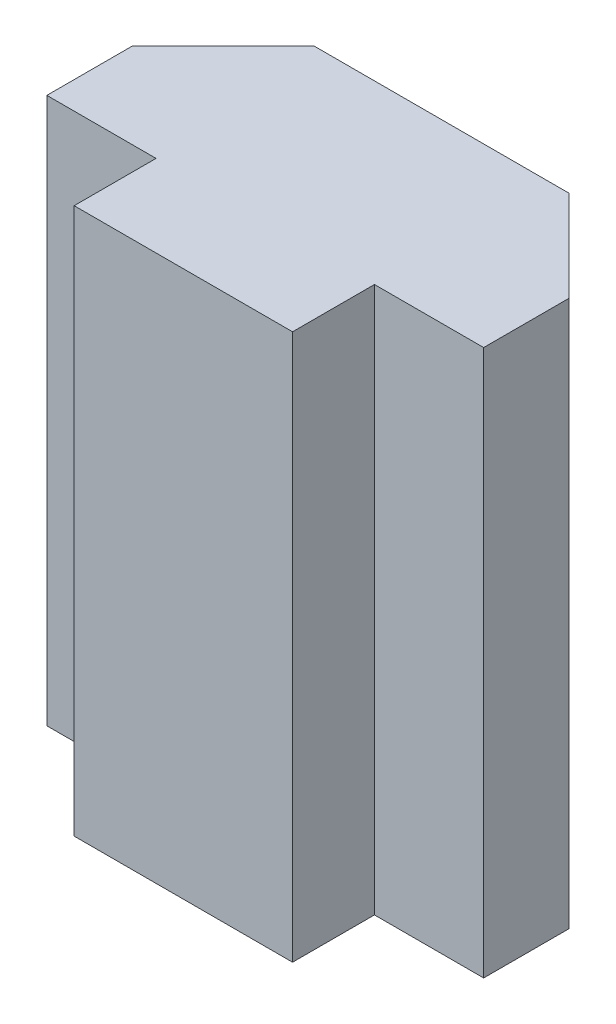
ISO-10303-21;
HEADER;
FILE_DESCRIPTION(('STEP AP214'),'2;1');
FILE_NAME('part.step','',(''),(''),'','','');
FILE_SCHEMA(('AUTOMOTIVE_DESIGN { 1 0 10303 214 1 1 1 1 }'));
ENDSEC;
DATA;
#1=APPLICATION_CONTEXT('core data for automotive mechanical design processes');
#2=APPLICATION_PROTOCOL_DEFINITION('international standard','automotive_design',2000,#1);
#3=PRODUCT_CONTEXT('',#1,'mechanical');
#4=PRODUCT('Part','Part','',(#3));
#5=PRODUCT_RELATED_PRODUCT_CATEGORY('part','',(#4));
#6=PRODUCT_DEFINITION_FORMATION('','',#4);
#7=PRODUCT_DEFINITION_CONTEXT('part definition',#1,'design');
#8=PRODUCT_DEFINITION('design','',#6,#7);
#9=PRODUCT_DEFINITION_SHAPE('','',#8);
#10=(LENGTH_UNIT() NAMED_UNIT(*) SI_UNIT(.MILLI.,.METRE.));
#11=(NAMED_UNIT(*) PLANE_ANGLE_UNIT() SI_UNIT($,.RADIAN.));
#12=(NAMED_UNIT(*) SI_UNIT($,.STERADIAN.) SOLID_ANGLE_UNIT());
#13=UNCERTAINTY_MEASURE_WITH_UNIT(LENGTH_MEASURE(1.E-05),#10,'distance_accuracy_value','');
#14=(GEOMETRIC_REPRESENTATION_CONTEXT(3) GLOBAL_UNCERTAINTY_ASSIGNED_CONTEXT((#13)) GLOBAL_UNIT_ASSIGNED_CONTEXT((#10,
#11,#12)) REPRESENTATION_CONTEXT('',''));
#15=CARTESIAN_POINT('',(0.,0.,0.));
#16=DIRECTION('',(0.,0.,1.));
#17=DIRECTION('',(1.,0.,0.));
#18=AXIS2_PLACEMENT_3D('',#15,#16,#17);
#19=CARTESIAN_POINT('',(-1.74789245707196,0.,0.));
#20=DIRECTION('',(1.,0.,0.));
#21=DIRECTION('',(0.,1.,0.));
#22=AXIS2_PLACEMENT_3D('',#19,#20,#21);
#23=PLANE('',#22);
#24=DIRECTION('',(0.,-1.,0.));
#25=VECTOR('',#24,1.);
#26=CARTESIAN_POINT('',(-1.74789245707196,20.,3.));
#27=LINE('',#26,#25);
#28=CARTESIAN_POINT('',(-1.74789245707196,20.,3.));
#29=VERTEX_POINT('',#28);
#30=CARTESIAN_POINT('',(-1.74789245707196,0.,3.));
#31=VERTEX_POINT('',#30);
#32=EDGE_CURVE('E115',#29,#31,#27,.T.);
#33=ORIENTED_EDGE('',*,*,#32,.F.);
#34=DIRECTION('',(0.,0.,1.));
#35=VECTOR('',#34,1.);
#36=CARTESIAN_POINT('',(-1.74789245707196,20.,0.));
#37=LINE('',#36,#35);
#38=CARTESIAN_POINT('',(-1.74789245707196,20.,0.));
#39=VERTEX_POINT('',#38);
#40=EDGE_CURVE('E181',#39,#29,#37,.T.);
#41=ORIENTED_EDGE('',*,*,#40,.F.);
#42=DIRECTION('',(0.,-1.,0.));
#43=VECTOR('',#42,1.);
#44=CARTESIAN_POINT('',(-1.74789245707197,40.,0.));
#45=LINE('',#44,#43);
#46=CARTESIAN_POINT('',(-1.74789245707196,0.,0.));
#47=VERTEX_POINT('',#46);
#48=EDGE_CURVE('E131',#39,#47,#45,.T.);
#49=ORIENTED_EDGE('',*,*,#48,.T.);
#50=DIRECTION('',(0.,0.,1.));
#51=VECTOR('',#50,1.);
#52=CARTESIAN_POINT('',(-1.74789245707196,0.,5.));
#53=LINE('',#52,#51);
#54=EDGE_CURVE('E127',#47,#31,#53,.T.);
#55=ORIENTED_EDGE('',*,*,#54,.T.);
#56=EDGE_LOOP('',(#33,#41,#49,#55));
#57=FACE_BOUND('',#56,.T.);
#58=ADVANCED_FACE('F39',(#57),#23,.F.);
#59=CARTESIAN_POINT('',(6.25210754292804,0.,0.));
#60=DIRECTION('',(1.,0.,0.));
#61=DIRECTION('',(0.,1.,0.));
#62=AXIS2_PLACEMENT_3D('',#59,#60,#61);
#63=PLANE('',#62);
#64=DIRECTION('',(0.,0.,1.));
#65=VECTOR('',#64,1.);
#66=CARTESIAN_POINT('',(6.25210754292804,20.,0.));
#67=LINE('',#66,#65);
#68=CARTESIAN_POINT('',(6.25210754292804,20.,0.));
#69=VERTEX_POINT('',#68);
#70=CARTESIAN_POINT('',(6.25210754292804,20.,3.));
#71=VERTEX_POINT('',#70);
#72=EDGE_CURVE('E11',#69,#71,#67,.T.);
#73=ORIENTED_EDGE('',*,*,#72,.T.);
#74=DIRECTION('',(0.,1.,0.));
#75=VECTOR('',#74,1.);
#76=CARTESIAN_POINT('',(6.25210754292804,20.,3.));
#77=LINE('',#76,#75);
#78=CARTESIAN_POINT('',(6.25210754292804,0.,3.));
#79=VERTEX_POINT('',#78);
#80=EDGE_CURVE('E54',#79,#71,#77,.T.);
#81=ORIENTED_EDGE('',*,*,#80,.F.);
#82=DIRECTION('',(0.,0.,-1.));
#83=VECTOR('',#82,1.);
#84=CARTESIAN_POINT('',(6.25210754292804,0.,5.));
#85=LINE('',#84,#83);
#86=CARTESIAN_POINT('',(6.25210754292804,0.,0.));
#87=VERTEX_POINT('',#86);
#88=EDGE_CURVE('E61',#79,#87,#85,.T.);
#89=ORIENTED_EDGE('',*,*,#88,.T.);
#90=DIRECTION('',(0.,1.,0.));
#91=VECTOR('',#90,1.);
#92=CARTESIAN_POINT('',(6.25210754292803,40.,0.));
#93=LINE('',#92,#91);
#94=EDGE_CURVE('E137',#87,#69,#93,.T.);
#95=ORIENTED_EDGE('',*,*,#94,.T.);
#96=EDGE_LOOP('',(#73,#81,#89,#95));
#97=FACE_BOUND('',#96,.T.);
#98=ADVANCED_FACE('F195',(#97),#63,.T.);
#99=CARTESIAN_POINT('',(0.,0.,0.));
#100=DIRECTION('',(0.,1.,0.));
#101=DIRECTION('',(0.,0.,1.));
#102=AXIS2_PLACEMENT_3D('',#99,#100,#101);
#103=PLANE('',#102);
#104=DIRECTION('',(1.,0.,0.));
#105=VECTOR('',#104,1.);
#106=CARTESIAN_POINT('',(-1.74789245707196,0.,3.));
#107=LINE('',#106,#105);
#108=EDGE_CURVE('E118',#31,#79,#107,.T.);
#109=ORIENTED_EDGE('',*,*,#108,.F.);
#110=ORIENTED_EDGE('',*,*,#54,.F.);
#111=DIRECTION('',(-1.,0.,0.));
#112=VECTOR('',#111,1.);
#113=CARTESIAN_POINT('',(9.75210754292804,0.,0.));
#114=LINE('',#113,#112);
#115=CARTESIAN_POINT('',(-5.74789245707196,0.,0.));
#116=VERTEX_POINT('',#115);
#117=EDGE_CURVE('E165',#47,#116,#114,.T.);
#118=ORIENTED_EDGE('',*,*,#117,.T.);
#119=DIRECTION('',(0.,0.,1.));
#120=VECTOR('',#119,1.);
#121=CARTESIAN_POINT('',(-5.74789245707196,0.,-2.5));
#122=LINE('',#121,#120);
#123=CARTESIAN_POINT('',(-5.74789245707196,0.,-3.13137084989846));
#124=VERTEX_POINT('',#123);
#125=EDGE_CURVE('E144',#124,#116,#122,.T.);
#126=ORIENTED_EDGE('',*,*,#125,.F.);
#127=DIRECTION('',(0.707106781186544,0.,-0.707106781186551));
#128=VECTOR('',#127,1.);
#129=CARTESIAN_POINT('',(-4.43963165348524,0.,-4.4396316534852));
#130=LINE('',#129,#128);
#131=CARTESIAN_POINT('',(-2.41946533232582,0.,-6.45979797464463));
#132=VERTEX_POINT('',#131);
#133=EDGE_CURVE('E148',#124,#132,#130,.T.);
#134=ORIENTED_EDGE('',*,*,#133,.T.);
#135=DIRECTION('',(1.,0.,0.));
#136=VECTOR('',#135,1.);
#137=CARTESIAN_POINT('',(0.,0.,-6.45979797464463));
#138=LINE('',#137,#136);
#139=CARTESIAN_POINT('',(6.92368041818186,0.,-6.45979797464463));
#140=VERTEX_POINT('',#139);
#141=EDGE_CURVE('E145',#132,#140,#138,.T.);
#142=ORIENTED_EDGE('',*,*,#141,.T.);
#143=DIRECTION('',(0.707106781186549,0.,0.707106781186546));
#144=VECTOR('',#143,1.);
#145=CARTESIAN_POINT('',(6.69173919641323,0.,-6.69173919641326));
#146=LINE('',#145,#144);
#147=CARTESIAN_POINT('',(10.252107542928,0.,-3.13137084989848));
#148=VERTEX_POINT('',#147);
#149=EDGE_CURVE('E141',#140,#148,#146,.T.);
#150=ORIENTED_EDGE('',*,*,#149,.T.);
#151=DIRECTION('',(0.,0.,-1.));
#152=VECTOR('',#151,1.);
#153=CARTESIAN_POINT('',(10.252107542928,0.,-2.5));
#154=LINE('',#153,#152);
#155=CARTESIAN_POINT('',(10.252107542928,0.,0.));
#156=VERTEX_POINT('',#155);
#157=EDGE_CURVE('E163',#156,#148,#154,.T.);
#158=ORIENTED_EDGE('',*,*,#157,.F.);
#159=EDGE_CURVE('E47',#156,#87,#114,.T.);
#160=ORIENTED_EDGE('',*,*,#159,.T.);
#161=ORIENTED_EDGE('',*,*,#88,.F.);
#162=EDGE_LOOP('',(#109,#110,#118,#126,#134,#142,#150,#158,#160,#161));
#163=FACE_BOUND('',#162,.T.);
#164=ADVANCED_FACE('F41',(#163),#103,.F.);
#165=CARTESIAN_POINT('',(0.,20.,-15.));
#166=DIRECTION('',(0.,1.,0.));
#167=DIRECTION('',(0.,0.,1.));
#168=AXIS2_PLACEMENT_3D('',#165,#166,#167);
#169=PLANE('',#168);
#170=ORIENTED_EDGE('',*,*,#40,.T.);
#171=DIRECTION('',(-1.,0.,0.));
#172=VECTOR('',#171,1.);
#173=CARTESIAN_POINT('',(-1.74789245707196,20.,3.));
#174=LINE('',#173,#172);
#175=EDGE_CURVE('E119',#71,#29,#174,.T.);
#176=ORIENTED_EDGE('',*,*,#175,.F.);
#177=ORIENTED_EDGE('',*,*,#72,.F.);
#178=DIRECTION('',(1.,0.,0.));
#179=VECTOR('',#178,1.);
#180=CARTESIAN_POINT('',(0.,20.,0.));
#181=LINE('',#180,#179);
#182=CARTESIAN_POINT('',(10.252107542928,20.,0.));
#183=VERTEX_POINT('',#182);
#184=EDGE_CURVE('E186',#69,#183,#181,.T.);
#185=ORIENTED_EDGE('',*,*,#184,.T.);
#186=DIRECTION('',(0.,0.,1.));
#187=VECTOR('',#186,1.);
#188=CARTESIAN_POINT('',(10.252107542928,20.,-15.));
#189=LINE('',#188,#187);
#190=CARTESIAN_POINT('',(10.252107542928,20.,-3.13137084989848));
#191=VERTEX_POINT('',#190);
#192=EDGE_CURVE('E201',#191,#183,#189,.T.);
#193=ORIENTED_EDGE('',*,*,#192,.F.);
#194=DIRECTION('',(0.707106781186549,0.,0.707106781186546));
#195=VECTOR('',#194,1.);
#196=CARTESIAN_POINT('',(6.69173919641323,20.,-6.69173919641326));
#197=LINE('',#196,#195);
#198=CARTESIAN_POINT('',(6.92368041818186,20.,-6.45979797464463));
#199=VERTEX_POINT('',#198);
#200=EDGE_CURVE('E180',#199,#191,#197,.T.);
#201=ORIENTED_EDGE('',*,*,#200,.F.);
#202=DIRECTION('',(1.,0.,0.));
#203=VECTOR('',#202,1.);
#204=CARTESIAN_POINT('',(0.,20.,-6.45979797464463));
#205=LINE('',#204,#203);
#206=CARTESIAN_POINT('',(-2.41946533232582,20.,-6.45979797464463));
#207=VERTEX_POINT('',#206);
#208=EDGE_CURVE('E184',#207,#199,#205,.T.);
#209=ORIENTED_EDGE('',*,*,#208,.F.);
#210=DIRECTION('',(0.707106781186544,0.,-0.707106781186551));
#211=VECTOR('',#210,1.);
#212=CARTESIAN_POINT('',(-4.43963165348524,20.,-4.4396316534852));
#213=LINE('',#212,#211);
#214=CARTESIAN_POINT('',(-5.74789245707196,20.,-3.13137084989846));
#215=VERTEX_POINT('',#214);
#216=EDGE_CURVE('E192',#215,#207,#213,.T.);
#217=ORIENTED_EDGE('',*,*,#216,.F.);
#218=DIRECTION('',(0.,0.,1.));
#219=VECTOR('',#218,1.);
#220=CARTESIAN_POINT('',(-5.74789245707196,20.,-15.));
#221=LINE('',#220,#219);
#222=CARTESIAN_POINT('',(-5.74789245707196,20.,0.));
#223=VERTEX_POINT('',#222);
#224=EDGE_CURVE('E202',#215,#223,#221,.T.);
#225=ORIENTED_EDGE('',*,*,#224,.T.);
#226=DIRECTION('',(1.,0.,0.));
#227=VECTOR('',#226,1.);
#228=CARTESIAN_POINT('',(0.,20.,0.));
#229=LINE('',#228,#227);
#230=EDGE_CURVE('E178',#223,#39,#229,.T.);
#231=ORIENTED_EDGE('',*,*,#230,.T.);
#232=EDGE_LOOP('',(#170,#176,#177,#185,#193,#201,#209,#217,#225,#231));
#233=FACE_BOUND('',#232,.T.);
#234=ADVANCED_FACE('F207',(#233),#169,.T.);
#235=CARTESIAN_POINT('',(0.,0.,0.));
#236=DIRECTION('',(0.,0.,-1.));
#237=DIRECTION('',(-1.,0.,0.));
#238=AXIS2_PLACEMENT_3D('',#235,#236,#237);
#239=PLANE('',#238);
#240=ORIENTED_EDGE('',*,*,#230,.F.);
#241=DIRECTION('',(0.,1.,0.));
#242=VECTOR('',#241,1.);
#243=CARTESIAN_POINT('',(-5.74789245707196,40.,0.));
#244=LINE('',#243,#242);
#245=EDGE_CURVE('E158',#116,#223,#244,.T.);
#246=ORIENTED_EDGE('',*,*,#245,.F.);
#247=ORIENTED_EDGE('',*,*,#117,.F.);
#248=ORIENTED_EDGE('',*,*,#48,.F.);
#249=EDGE_LOOP('',(#240,#246,#247,#248));
#250=FACE_BOUND('',#249,.T.);
#251=ADVANCED_FACE('F177',(#250),#239,.F.);
#252=ORIENTED_EDGE('',*,*,#184,.F.);
#253=ORIENTED_EDGE('',*,*,#94,.F.);
#254=ORIENTED_EDGE('',*,*,#159,.F.);
#255=DIRECTION('',(0.,-1.,0.));
#256=VECTOR('',#255,1.);
#257=CARTESIAN_POINT('',(10.252107542928,40.,0.));
#258=LINE('',#257,#256);
#259=EDGE_CURVE('E161',#183,#156,#258,.T.);
#260=ORIENTED_EDGE('',*,*,#259,.F.);
#261=EDGE_LOOP('',(#252,#253,#254,#260));
#262=FACE_BOUND('',#261,.T.);
#263=ADVANCED_FACE('F198',(#262),#239,.F.);
#264=CARTESIAN_POINT('',(10.252107542928,0.,0.));
#265=DIRECTION('',(-1.,0.,0.));
#266=DIRECTION('',(0.,-1.,0.));
#267=AXIS2_PLACEMENT_3D('',#264,#265,#266);
#268=PLANE('',#267);
#269=ORIENTED_EDGE('',*,*,#192,.T.);
#270=ORIENTED_EDGE('',*,*,#259,.T.);
#271=ORIENTED_EDGE('',*,*,#157,.T.);
#272=DIRECTION('',(0.,-1.,0.));
#273=VECTOR('',#272,1.);
#274=CARTESIAN_POINT('',(10.252107542928,56.4827182224292,-3.13137084989848));
#275=LINE('',#274,#273);
#276=EDGE_CURVE('E133',#191,#148,#275,.T.);
#277=ORIENTED_EDGE('',*,*,#276,.F.);
#278=EDGE_LOOP('',(#269,#270,#271,#277));
#279=FACE_BOUND('',#278,.T.);
#280=ADVANCED_FACE('F219',(#279),#268,.F.);
#281=CARTESIAN_POINT('',(-5.74789245707196,0.,0.));
#282=DIRECTION('',(-1.,0.,0.));
#283=DIRECTION('',(0.,-1.,0.));
#284=AXIS2_PLACEMENT_3D('',#281,#282,#283);
#285=PLANE('',#284);
#286=ORIENTED_EDGE('',*,*,#245,.T.);
#287=ORIENTED_EDGE('',*,*,#224,.F.);
#288=DIRECTION('',(0.,-1.,0.));
#289=VECTOR('',#288,1.);
#290=CARTESIAN_POINT('',(-5.74789245707196,56.4827182224292,-3.13137084989846));
#291=LINE('',#290,#289);
#292=EDGE_CURVE('E150',#215,#124,#291,.T.);
#293=ORIENTED_EDGE('',*,*,#292,.T.);
#294=ORIENTED_EDGE('',*,*,#125,.T.);
#295=EDGE_LOOP('',(#286,#287,#293,#294));
#296=FACE_BOUND('',#295,.T.);
#297=ADVANCED_FACE('F173',(#296),#285,.T.);
#298=CARTESIAN_POINT('',(-4.43963165348524,56.4827182224292,-4.4396316534852));
#299=DIRECTION('',(-0.707106781186551,0.,-0.707106781186544));
#300=DIRECTION('',(-0.707106781186544,0.,0.707106781186551));
#301=AXIS2_PLACEMENT_3D('',#298,#299,#300);
#302=PLANE('',#301);
#303=ORIENTED_EDGE('',*,*,#292,.F.);
#304=ORIENTED_EDGE('',*,*,#216,.T.);
#305=DIRECTION('',(0.,-1.,0.));
#306=VECTOR('',#305,1.);
#307=CARTESIAN_POINT('',(-2.41946533232582,56.4827182224292,-6.45979797464463));
#308=LINE('',#307,#306);
#309=EDGE_CURVE('E153',#207,#132,#308,.T.);
#310=ORIENTED_EDGE('',*,*,#309,.T.);
#311=ORIENTED_EDGE('',*,*,#133,.F.);
#312=EDGE_LOOP('',(#303,#304,#310,#311));
#313=FACE_BOUND('',#312,.T.);
#314=ADVANCED_FACE('F209',(#313),#302,.T.);
#315=CARTESIAN_POINT('',(0.,56.4827182224292,-6.45979797464463));
#316=DIRECTION('',(0.,0.,-1.));
#317=DIRECTION('',(-1.,0.,0.));
#318=AXIS2_PLACEMENT_3D('',#315,#316,#317);
#319=PLANE('',#318);
#320=ORIENTED_EDGE('',*,*,#309,.F.);
#321=ORIENTED_EDGE('',*,*,#208,.T.);
#322=DIRECTION('',(0.,-1.,0.));
#323=VECTOR('',#322,1.);
#324=CARTESIAN_POINT('',(6.92368041818186,56.4827182224292,-6.45979797464463));
#325=LINE('',#324,#323);
#326=EDGE_CURVE('E135',#199,#140,#325,.T.);
#327=ORIENTED_EDGE('',*,*,#326,.T.);
#328=ORIENTED_EDGE('',*,*,#141,.F.);
#329=EDGE_LOOP('',(#320,#321,#327,#328));
#330=FACE_BOUND('',#329,.T.);
#331=ADVANCED_FACE('F220',(#330),#319,.T.);
#332=CARTESIAN_POINT('',(6.69173919641323,56.4827182224292,-6.69173919641326));
#333=DIRECTION('',(0.707106781186546,0.,-0.707106781186549));
#334=DIRECTION('',(-0.707106781186549,0.,-0.707106781186546));
#335=AXIS2_PLACEMENT_3D('',#332,#333,#334);
#336=PLANE('',#335);
#337=ORIENTED_EDGE('',*,*,#326,.F.);
#338=ORIENTED_EDGE('',*,*,#200,.T.);
#339=ORIENTED_EDGE('',*,*,#276,.T.);
#340=ORIENTED_EDGE('',*,*,#149,.F.);
#341=EDGE_LOOP('',(#337,#338,#339,#340));
#342=FACE_BOUND('',#341,.T.);
#343=ADVANCED_FACE('F216',(#342),#336,.T.);
#344=CARTESIAN_POINT('',(0.,0.,3.));
#345=DIRECTION('',(0.,0.,1.));
#346=DIRECTION('',(1.,0.,0.));
#347=AXIS2_PLACEMENT_3D('',#344,#345,#346);
#348=PLANE('',#347);
#349=ORIENTED_EDGE('',*,*,#32,.T.);
#350=ORIENTED_EDGE('',*,*,#108,.T.);
#351=ORIENTED_EDGE('',*,*,#80,.T.);
#352=ORIENTED_EDGE('',*,*,#175,.T.);
#353=EDGE_LOOP('',(#349,#350,#351,#352));
#354=FACE_BOUND('',#353,.T.);
#355=ADVANCED_FACE('F117',(#354),#348,.T.);
#356=CLOSED_SHELL('',(#58,#98,#164,#234,#251,#263,#280,#297,#314,#331,#343,#355));
#357=MANIFOLD_SOLID_BREP('B2',#356);
#358=ADVANCED_BREP_SHAPE_REPRESENTATION('',(#18,#357),#14);
#359=SHAPE_DEFINITION_REPRESENTATION(#9,#358);
ENDSEC;
END-ISO-10303-21;
